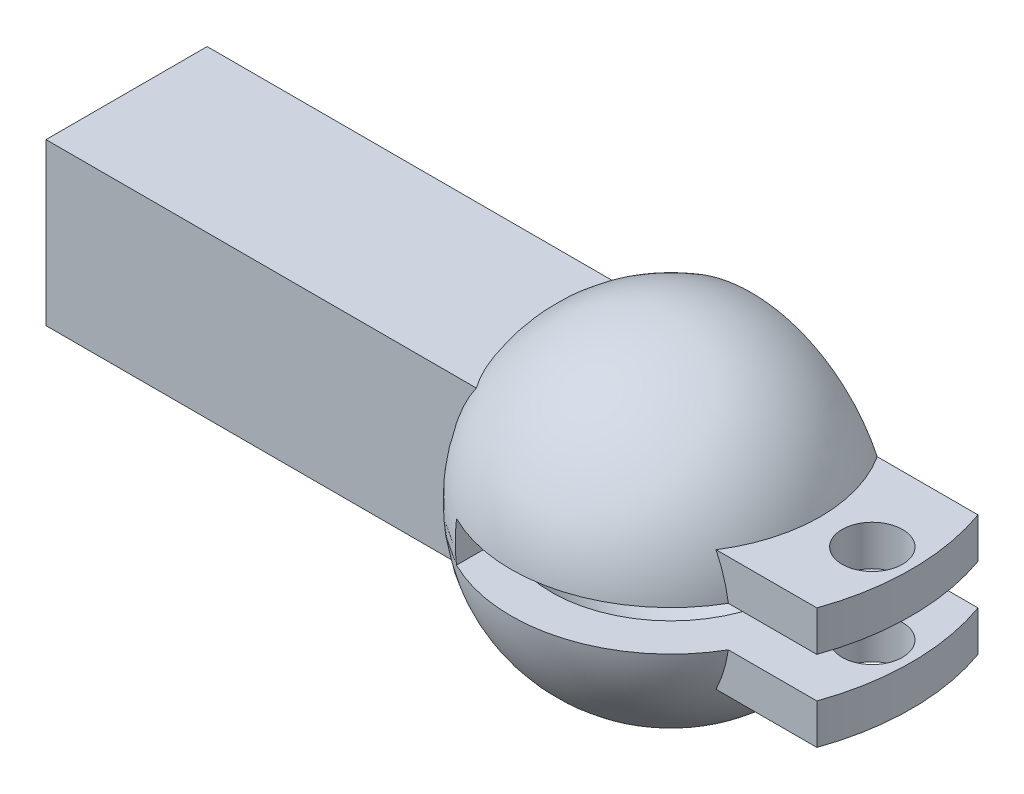
ISO-10303-21;
HEADER;
FILE_DESCRIPTION(('STEP AP214'),'2;1');
FILE_NAME('part.step','',(''),(''),'','','');
FILE_SCHEMA(('AUTOMOTIVE_DESIGN { 1 0 10303 214 1 1 1 1 }'));
ENDSEC;
DATA;
#1=APPLICATION_CONTEXT('core data for automotive mechanical design processes');
#2=APPLICATION_PROTOCOL_DEFINITION('international standard','automotive_design',2000,#1);
#3=PRODUCT_CONTEXT('',#1,'mechanical');
#4=PRODUCT('Part','Part','',(#3));
#5=PRODUCT_RELATED_PRODUCT_CATEGORY('part','',(#4));
#6=PRODUCT_DEFINITION_FORMATION('','',#4);
#7=PRODUCT_DEFINITION_CONTEXT('part definition',#1,'design');
#8=PRODUCT_DEFINITION('design','',#6,#7);
#9=PRODUCT_DEFINITION_SHAPE('','',#8);
#10=(LENGTH_UNIT() NAMED_UNIT(*) SI_UNIT(.MILLI.,.METRE.));
#11=(NAMED_UNIT(*) PLANE_ANGLE_UNIT() SI_UNIT($,.RADIAN.));
#12=(NAMED_UNIT(*) SI_UNIT($,.STERADIAN.) SOLID_ANGLE_UNIT());
#13=UNCERTAINTY_MEASURE_WITH_UNIT(LENGTH_MEASURE(1.E-05),#10,'distance_accuracy_value','');
#14=(GEOMETRIC_REPRESENTATION_CONTEXT(3) GLOBAL_UNCERTAINTY_ASSIGNED_CONTEXT((#13)) GLOBAL_UNIT_ASSIGNED_CONTEXT((#10,
#11,#12)) REPRESENTATION_CONTEXT('',''));
#15=CARTESIAN_POINT('',(0.,0.,0.));
#16=DIRECTION('',(0.,0.,1.));
#17=DIRECTION('',(1.,0.,0.));
#18=AXIS2_PLACEMENT_3D('',#15,#16,#17);
#19=CARTESIAN_POINT('',(27.0196854276496,4.,4.));
#20=DIRECTION('',(0.,-1.,0.));
#21=DIRECTION('',(-1.,0.,0.));
#22=AXIS2_PLACEMENT_3D('',#19,#20,#21);
#23=SPHERICAL_SURFACE('',#22,8.);
#24=CARTESIAN_POINT('',(27.0196854276496,4.,8.));
#25=DIRECTION('',(0.,0.,-1.));
#26=DIRECTION('',(-1.,0.,0.));
#27=AXIS2_PLACEMENT_3D('',#24,#25,#26);
#28=CIRCLE('',#27,6.92820323027551);
#29=CARTESIAN_POINT('',(33.8753400280507,3.,8.));
#30=VERTEX_POINT('',#29);
#31=CARTESIAN_POINT('',(33.264683426048,0.999999999999999,8.));
#32=VERTEX_POINT('',#31);
#33=EDGE_CURVE('E179',#30,#32,#28,.T.);
#34=ORIENTED_EDGE('',*,*,#33,.F.);
#35=CARTESIAN_POINT('',(27.0196854276496,3.,4.));
#36=DIRECTION('',(0.,-1.,0.));
#37=DIRECTION('',(0.,0.,-1.));
#38=AXIS2_PLACEMENT_3D('',#35,#36,#37);
#39=CIRCLE('',#38,7.93725393319377);
#40=CARTESIAN_POINT('',(23.4861986461041,3.,11.1073533164353));
#41=VERTEX_POINT('',#40);
#42=EDGE_CURVE('E239',#30,#41,#39,.T.);
#43=ORIENTED_EDGE('',*,*,#42,.T.);
#44=CARTESIAN_POINT('',(23.4861986461041,4.,4.));
#45=DIRECTION('',(-1.,0.,0.));
#46=DIRECTION('',(0.,0.,1.));
#47=AXIS2_PLACEMENT_3D('',#44,#45,#46);
#48=CIRCLE('',#47,7.17735823020165);
#49=CARTESIAN_POINT('',(23.4861986461041,5.,11.1073533164353));
#50=VERTEX_POINT('',#49);
#51=EDGE_CURVE('E241',#41,#50,#48,.T.);
#52=ORIENTED_EDGE('',*,*,#51,.T.);
#53=CARTESIAN_POINT('',(27.0196854276496,5.,4.));
#54=DIRECTION('',(0.,1.,0.));
#55=DIRECTION('',(0.,0.,1.));
#56=AXIS2_PLACEMENT_3D('',#53,#54,#55);
#57=CIRCLE('',#56,7.93725393319377);
#58=CARTESIAN_POINT('',(33.8753400280507,5.,8.));
#59=VERTEX_POINT('',#58);
#60=EDGE_CURVE('E246',#50,#59,#57,.T.);
#61=ORIENTED_EDGE('',*,*,#60,.T.);
#62=CARTESIAN_POINT('',(27.0196854276496,4.,8.));
#63=DIRECTION('',(0.,0.,1.));
#64=DIRECTION('',(1.,0.,0.));
#65=AXIS2_PLACEMENT_3D('',#62,#63,#64);
#66=CIRCLE('',#65,6.92820323027551);
#67=CARTESIAN_POINT('',(33.264683426048,7.,8.));
#68=VERTEX_POINT('',#67);
#69=EDGE_CURVE('E213',#59,#68,#66,.T.);
#70=ORIENTED_EDGE('',*,*,#69,.T.);
#71=CARTESIAN_POINT('',(27.0196854276496,7.,4.));
#72=DIRECTION('',(0.,1.,0.));
#73=DIRECTION('',(0.,0.,1.));
#74=AXIS2_PLACEMENT_3D('',#71,#72,#73);
#75=CIRCLE('',#74,7.41619848709566);
#76=CARTESIAN_POINT('',(33.264683426048,7.,0.));
#77=VERTEX_POINT('',#76);
#78=EDGE_CURVE('E218',#68,#77,#75,.T.);
#79=ORIENTED_EDGE('',*,*,#78,.T.);
#80=CARTESIAN_POINT('',(27.0196854276496,4.,0.));
#81=DIRECTION('',(0.,0.,-1.));
#82=DIRECTION('',(-1.,0.,0.));
#83=AXIS2_PLACEMENT_3D('',#80,#81,#82);
#84=CIRCLE('',#83,6.92820323027551);
#85=CARTESIAN_POINT('',(21.3628311781572,8.,0.));
#86=VERTEX_POINT('',#85);
#87=EDGE_CURVE('E260',#86,#77,#84,.T.);
#88=ORIENTED_EDGE('',*,*,#87,.F.);
#89=CARTESIAN_POINT('',(27.0196854276496,8.,4.));
#90=DIRECTION('',(0.,-1.,0.));
#91=DIRECTION('',(0.,0.,-1.));
#92=AXIS2_PLACEMENT_3D('',#89,#90,#91);
#93=CIRCLE('',#92,6.9282032302755);
#94=CARTESIAN_POINT('',(21.3628311781572,8.,8.));
#95=VERTEX_POINT('',#94);
#96=EDGE_CURVE('E278',#86,#95,#93,.F.);
#97=ORIENTED_EDGE('',*,*,#96,.T.);
#98=CARTESIAN_POINT('',(27.0196854276496,4.,8.));
#99=DIRECTION('',(0.,0.,1.));
#100=DIRECTION('',(1.,0.,0.));
#101=AXIS2_PLACEMENT_3D('',#98,#99,#100);
#102=CIRCLE('',#101,6.92820323027551);
#103=CARTESIAN_POINT('',(21.3628311781572,0.,8.));
#104=VERTEX_POINT('',#103);
#105=EDGE_CURVE('E289',#95,#104,#102,.T.);
#106=ORIENTED_EDGE('',*,*,#105,.T.);
#107=CARTESIAN_POINT('',(27.0196854276496,0.,4.));
#108=DIRECTION('',(0.,-1.,0.));
#109=DIRECTION('',(1.,0.,0.));
#110=AXIS2_PLACEMENT_3D('',#107,#108,#109);
#111=CIRCLE('',#110,6.92820323027551);
#112=CARTESIAN_POINT('',(21.3628311781572,0.,0.));
#113=VERTEX_POINT('',#112);
#114=EDGE_CURVE('E275',#113,#104,#111,.F.);
#115=ORIENTED_EDGE('',*,*,#114,.F.);
#116=CARTESIAN_POINT('',(33.264683426048,0.999999999999999,0.));
#117=VERTEX_POINT('',#116);
#118=EDGE_CURVE('E66',#117,#113,#84,.T.);
#119=ORIENTED_EDGE('',*,*,#118,.F.);
#120=CARTESIAN_POINT('',(27.0196854276496,0.999999999999999,4.));
#121=DIRECTION('',(0.,1.,0.));
#122=DIRECTION('',(0.,0.,-1.));
#123=AXIS2_PLACEMENT_3D('',#120,#121,#122);
#124=CIRCLE('',#123,7.41619848709566);
#125=EDGE_CURVE('E61',#32,#117,#124,.T.);
#126=ORIENTED_EDGE('',*,*,#125,.F.);
#127=EDGE_LOOP('',(#34,#43,#52,#61,#70,#79,#88,#97,#106,#115,#119,#126));
#128=FACE_BOUND('',#127,.T.);
#129=ADVANCED_FACE('F45',(#128),#23,.T.);
#130=CARTESIAN_POINT('',(0.,8.,4.));
#131=DIRECTION('',(0.,-1.,0.));
#132=DIRECTION('',(0.,0.,-1.));
#133=AXIS2_PLACEMENT_3D('',#130,#131,#132);
#134=PLANE('',#133);
#135=DIRECTION('',(-1.,0.,0.));
#136=VECTOR('',#135,1.);
#137=CARTESIAN_POINT('',(0.,8.,0.));
#138=LINE('',#137,#136);
#139=CARTESIAN_POINT('',(0.,8.,0.));
#140=VERTEX_POINT('',#139);
#141=EDGE_CURVE('E280',#86,#140,#138,.T.);
#142=ORIENTED_EDGE('',*,*,#141,.T.);
#143=DIRECTION('',(0.,0.,1.));
#144=VECTOR('',#143,1.);
#145=CARTESIAN_POINT('',(0.,8.,0.));
#146=LINE('',#145,#144);
#147=CARTESIAN_POINT('',(0.,8.,8.));
#148=VERTEX_POINT('',#147);
#149=EDGE_CURVE('E255',#140,#148,#146,.T.);
#150=ORIENTED_EDGE('',*,*,#149,.T.);
#151=DIRECTION('',(-1.,0.,0.));
#152=VECTOR('',#151,1.);
#153=CARTESIAN_POINT('',(0.,8.,8.));
#154=LINE('',#153,#152);
#155=EDGE_CURVE('E265',#95,#148,#154,.T.);
#156=ORIENTED_EDGE('',*,*,#155,.F.);
#157=ORIENTED_EDGE('',*,*,#96,.F.);
#158=EDGE_LOOP('',(#142,#150,#156,#157));
#159=FACE_BOUND('',#158,.T.);
#160=ADVANCED_FACE('F47',(#159),#134,.F.);
#161=CARTESIAN_POINT('',(0.,0.,4.));
#162=DIRECTION('',(0.,-1.,0.));
#163=DIRECTION('',(1.,0.,0.));
#164=AXIS2_PLACEMENT_3D('',#161,#162,#163);
#165=PLANE('',#164);
#166=DIRECTION('',(0.,0.,1.));
#167=VECTOR('',#166,1.);
#168=CARTESIAN_POINT('',(0.,0.,0.));
#169=LINE('',#168,#167);
#170=CARTESIAN_POINT('',(0.,0.,0.));
#171=VERTEX_POINT('',#170);
#172=CARTESIAN_POINT('',(0.,0.,8.));
#173=VERTEX_POINT('',#172);
#174=EDGE_CURVE('E253',#171,#173,#169,.T.);
#175=ORIENTED_EDGE('',*,*,#174,.F.);
#176=DIRECTION('',(-1.,0.,0.));
#177=VECTOR('',#176,1.);
#178=CARTESIAN_POINT('',(0.,0.,0.));
#179=LINE('',#178,#177);
#180=EDGE_CURVE('E283',#113,#171,#179,.T.);
#181=ORIENTED_EDGE('',*,*,#180,.F.);
#182=ORIENTED_EDGE('',*,*,#114,.T.);
#183=DIRECTION('',(1.,0.,0.));
#184=VECTOR('',#183,1.);
#185=CARTESIAN_POINT('',(0.,0.,8.));
#186=LINE('',#185,#184);
#187=EDGE_CURVE('E263',#173,#104,#186,.T.);
#188=ORIENTED_EDGE('',*,*,#187,.F.);
#189=EDGE_LOOP('',(#175,#181,#182,#188));
#190=FACE_BOUND('',#189,.T.);
#191=ADVANCED_FACE('F340',(#190),#165,.T.);
#192=CARTESIAN_POINT('',(0.,0.,0.));
#193=DIRECTION('',(0.,0.,1.));
#194=DIRECTION('',(1.,0.,0.));
#195=AXIS2_PLACEMENT_3D('',#192,#193,#194);
#196=PLANE('',#195);
#197=DIRECTION('',(1.,0.,0.));
#198=VECTOR('',#197,1.);
#199=CARTESIAN_POINT('',(0.,3.,0.));
#200=LINE('',#199,#198);
#201=CARTESIAN_POINT('',(31.3785843711903,3.,0.));
#202=VERTEX_POINT('',#201);
#203=CARTESIAN_POINT('',(38.2668197944806,3.,0.));
#204=VERTEX_POINT('',#203);
#205=EDGE_CURVE('E176',#202,#204,#200,.T.);
#206=ORIENTED_EDGE('',*,*,#205,.T.);
#207=DIRECTION('',(0.,1.,0.));
#208=VECTOR('',#207,1.);
#209=CARTESIAN_POINT('',(38.2668197944806,0.999999999999999,0.));
#210=LINE('',#209,#208);
#211=CARTESIAN_POINT('',(38.2668197944806,0.999999999999999,0.));
#212=VERTEX_POINT('',#211);
#213=EDGE_CURVE('E173',#212,#204,#210,.T.);
#214=ORIENTED_EDGE('',*,*,#213,.F.);
#215=DIRECTION('',(1.,0.,0.));
#216=VECTOR('',#215,1.);
#217=CARTESIAN_POINT('',(33.264683426048,0.999999999999999,0.));
#218=LINE('',#217,#216);
#219=EDGE_CURVE('E163',#117,#212,#218,.T.);
#220=ORIENTED_EDGE('',*,*,#219,.F.);
#221=ORIENTED_EDGE('',*,*,#118,.T.);
#222=ORIENTED_EDGE('',*,*,#180,.T.);
#223=DIRECTION('',(0.,1.,0.));
#224=VECTOR('',#223,1.);
#225=CARTESIAN_POINT('',(0.,0.,0.));
#226=LINE('',#225,#224);
#227=EDGE_CURVE('E250',#171,#140,#226,.T.);
#228=ORIENTED_EDGE('',*,*,#227,.T.);
#229=ORIENTED_EDGE('',*,*,#141,.F.);
#230=ORIENTED_EDGE('',*,*,#87,.T.);
#231=DIRECTION('',(-1.,0.,0.));
#232=VECTOR('',#231,1.);
#233=CARTESIAN_POINT('',(32.5977813035285,7.,0.));
#234=LINE('',#233,#232);
#235=CARTESIAN_POINT('',(38.2668197944806,7.,0.));
#236=VERTEX_POINT('',#235);
#237=EDGE_CURVE('E202',#236,#77,#234,.T.);
#238=ORIENTED_EDGE('',*,*,#237,.F.);
#239=DIRECTION('',(0.,1.,0.));
#240=VECTOR('',#239,1.);
#241=CARTESIAN_POINT('',(38.2668197944806,5.,0.));
#242=LINE('',#241,#240);
#243=CARTESIAN_POINT('',(38.2668197944806,5.,0.));
#244=VERTEX_POINT('',#243);
#245=EDGE_CURVE('E211',#244,#236,#242,.T.);
#246=ORIENTED_EDGE('',*,*,#245,.F.);
#247=DIRECTION('',(-1.,0.,0.));
#248=VECTOR('',#247,1.);
#249=CARTESIAN_POINT('',(0.,5.,0.));
#250=LINE('',#249,#248);
#251=CARTESIAN_POINT('',(31.3785843711903,5.,0.));
#252=VERTEX_POINT('',#251);
#253=EDGE_CURVE('E244',#244,#252,#250,.T.);
#254=ORIENTED_EDGE('',*,*,#253,.T.);
#255=CARTESIAN_POINT('',(27.0196854276496,4.,0.));
#256=DIRECTION('',(0.,0.,-1.));
#257=DIRECTION('',(-1.,0.,0.));
#258=AXIS2_PLACEMENT_3D('',#255,#256,#257);
#259=CIRCLE('',#258,4.47213595499958);
#260=EDGE_CURVE('E258',#202,#252,#259,.T.);
#261=ORIENTED_EDGE('',*,*,#260,.F.);
#262=EDGE_LOOP('',(#206,#214,#220,#221,#222,#228,#229,#230,#238,#246,#254,#261));
#263=FACE_BOUND('',#262,.T.);
#264=ADVANCED_FACE('F174',(#263),#196,.F.);
#265=CARTESIAN_POINT('',(0.,0.,8.));
#266=DIRECTION('',(0.,0.,1.));
#267=DIRECTION('',(1.,0.,0.));
#268=AXIS2_PLACEMENT_3D('',#265,#266,#267);
#269=PLANE('',#268);
#270=DIRECTION('',(0.,1.,0.));
#271=VECTOR('',#270,1.);
#272=CARTESIAN_POINT('',(0.,0.,8.));
#273=LINE('',#272,#271);
#274=EDGE_CURVE('E249',#173,#148,#273,.T.);
#275=ORIENTED_EDGE('',*,*,#274,.F.);
#276=ORIENTED_EDGE('',*,*,#187,.T.);
#277=ORIENTED_EDGE('',*,*,#105,.F.);
#278=ORIENTED_EDGE('',*,*,#155,.T.);
#279=EDGE_LOOP('',(#275,#276,#277,#278));
#280=FACE_BOUND('',#279,.T.);
#281=ADVANCED_FACE('F345',(#280),#269,.T.);
#282=CARTESIAN_POINT('',(27.0196854276496,4.,4.));
#283=DIRECTION('',(0.,-1.,0.));
#284=DIRECTION('',(-1.,0.,0.));
#285=AXIS2_PLACEMENT_3D('',#282,#283,#284);
#286=SPHERICAL_SURFACE('',#285,6.);
#287=CARTESIAN_POINT('',(27.0196854276496,5.,4.));
#288=DIRECTION('',(0.,1.,0.));
#289=DIRECTION('',(0.,0.,1.));
#290=AXIS2_PLACEMENT_3D('',#287,#288,#289);
#291=CIRCLE('',#290,5.91607978309962);
#292=CARTESIAN_POINT('',(23.4861986461041,5.,8.74494163975105));
#293=VERTEX_POINT('',#292);
#294=EDGE_CURVE('E11',#293,#252,#291,.T.);
#295=ORIENTED_EDGE('',*,*,#294,.F.);
#296=CARTESIAN_POINT('',(23.4861986461041,4.,4.));
#297=DIRECTION('',(-1.,0.,0.));
#298=DIRECTION('',(0.,0.,1.));
#299=AXIS2_PLACEMENT_3D('',#296,#297,#298);
#300=CIRCLE('',#299,4.84917221437261);
#301=CARTESIAN_POINT('',(23.4861986461041,3.,8.74494163975105));
#302=VERTEX_POINT('',#301);
#303=EDGE_CURVE('E54',#302,#293,#300,.T.);
#304=ORIENTED_EDGE('',*,*,#303,.F.);
#305=CARTESIAN_POINT('',(27.0196854276496,3.,4.));
#306=DIRECTION('',(0.,-1.,0.));
#307=DIRECTION('',(0.,0.,-1.));
#308=AXIS2_PLACEMENT_3D('',#305,#306,#307);
#309=CIRCLE('',#308,5.91607978309962);
#310=EDGE_CURVE('E292',#202,#302,#309,.T.);
#311=ORIENTED_EDGE('',*,*,#310,.F.);
#312=ORIENTED_EDGE('',*,*,#260,.T.);
#313=EDGE_LOOP('',(#295,#304,#311,#312));
#314=FACE_BOUND('',#313,.T.);
#315=CARTESIAN_POINT('',(27.0196854276496,4.,4.));
#316=DIRECTION('',(0.,0.,1.));
#317=DIRECTION('',(1.,0.,0.));
#318=AXIS2_PLACEMENT_3D('',#315,#316,#317);
#319=CIRCLE('',#318,6.);
#320=CARTESIAN_POINT('',(21.5196854276496,1.60208423834363,4.));
#321=VERTEX_POINT('',#320);
#322=CARTESIAN_POINT('',(21.3628311781572,1.99999999999998,4.));
#323=VERTEX_POINT('',#322);
#324=EDGE_CURVE('E272',#321,#323,#319,.F.);
#325=ORIENTED_EDGE('',*,*,#324,.T.);
#326=CARTESIAN_POINT('',(21.3628311781572,4.,4.));
#327=DIRECTION('',(-1.,0.,0.));
#328=DIRECTION('',(0.,0.,1.));
#329=AXIS2_PLACEMENT_3D('',#326,#327,#328);
#330=CIRCLE('',#329,2.00000000000002);
#331=CARTESIAN_POINT('',(21.3628311781572,6.00000000000002,4.));
#332=VERTEX_POINT('',#331);
#333=EDGE_CURVE('E268',#323,#332,#330,.T.);
#334=ORIENTED_EDGE('',*,*,#333,.T.);
#335=CARTESIAN_POINT('',(21.5196854276496,6.39791576165636,4.));
#336=VERTEX_POINT('',#335);
#337=EDGE_CURVE('E271',#332,#336,#319,.F.);
#338=ORIENTED_EDGE('',*,*,#337,.T.);
#339=CARTESIAN_POINT('',(21.5196854276496,4.,4.));
#340=DIRECTION('',(-1.,0.,0.));
#341=DIRECTION('',(0.,0.,1.));
#342=AXIS2_PLACEMENT_3D('',#339,#340,#341);
#343=CIRCLE('',#342,2.39791576165636);
#344=EDGE_CURVE('E286',#321,#336,#343,.F.);
#345=ORIENTED_EDGE('',*,*,#344,.F.);
#346=EDGE_LOOP('',(#325,#334,#338,#345));
#347=FACE_BOUND('',#346,.T.);
#348=ADVANCED_FACE('F308',(#314,#347),#286,.F.);
#349=CARTESIAN_POINT('',(21.3628311781572,0.,8.));
#350=DIRECTION('',(-1.,0.,0.));
#351=DIRECTION('',(0.,0.,1.));
#352=AXIS2_PLACEMENT_3D('',#349,#350,#351);
#353=PLANE('',#352);
#354=ORIENTED_EDGE('',*,*,#333,.F.);
#355=DIRECTION('',(0.,-1.,0.));
#356=VECTOR('',#355,1.);
#357=CARTESIAN_POINT('',(21.3628311781572,6.39791576165636,4.));
#358=LINE('',#357,#356);
#359=CARTESIAN_POINT('',(21.3628311781572,1.60208423834363,4.));
#360=VERTEX_POINT('',#359);
#361=EDGE_CURVE('E221',#323,#360,#358,.T.);
#362=ORIENTED_EDGE('',*,*,#361,.T.);
#363=CARTESIAN_POINT('',(21.3628311781572,4.,4.));
#364=DIRECTION('',(-1.,0.,0.));
#365=DIRECTION('',(0.,0.,1.));
#366=AXIS2_PLACEMENT_3D('',#363,#364,#365);
#367=CIRCLE('',#366,2.39791576165636);
#368=CARTESIAN_POINT('',(21.3628311781572,6.39791576165636,4.));
#369=VERTEX_POINT('',#368);
#370=EDGE_CURVE('E225',#360,#369,#367,.F.);
#371=ORIENTED_EDGE('',*,*,#370,.T.);
#372=EDGE_CURVE('E222',#369,#332,#358,.T.);
#373=ORIENTED_EDGE('',*,*,#372,.T.);
#374=EDGE_LOOP('',(#354,#362,#371,#373));
#375=FACE_BOUND('',#374,.T.);
#376=ADVANCED_FACE('F363',(#375),#353,.F.);
#377=CARTESIAN_POINT('',(0.,0.,0.));
#378=DIRECTION('',(1.,0.,0.));
#379=DIRECTION('',(0.,0.,-1.));
#380=AXIS2_PLACEMENT_3D('',#377,#378,#379);
#381=PLANE('',#380);
#382=ORIENTED_EDGE('',*,*,#274,.T.);
#383=ORIENTED_EDGE('',*,*,#149,.F.);
#384=ORIENTED_EDGE('',*,*,#227,.F.);
#385=ORIENTED_EDGE('',*,*,#174,.T.);
#386=EDGE_LOOP('',(#382,#383,#384,#385));
#387=FACE_BOUND('',#386,.T.);
#388=ADVANCED_FACE('F361',(#387),#381,.F.);
#389=CARTESIAN_POINT('',(23.4861986461041,5.,12.));
#390=DIRECTION('',(0.,1.,0.));
#391=DIRECTION('',(0.,0.,1.));
#392=AXIS2_PLACEMENT_3D('',#389,#390,#391);
#393=PLANE('',#392);
#394=CARTESIAN_POINT('',(37.0196854276496,5.,4.));
#395=DIRECTION('',(0.,1.,0.));
#396=DIRECTION('',(0.,0.,1.));
#397=AXIS2_PLACEMENT_3D('',#394,#395,#396);
#398=CIRCLE('',#397,1.5);
#399=CARTESIAN_POINT('',(37.0196854276496,5.,5.5));
#400=VERTEX_POINT('',#399);
#401=EDGE_CURVE('E193',#400,#400,#398,.T.);
#402=ORIENTED_EDGE('',*,*,#401,.T.);
#403=EDGE_LOOP('',(#402));
#404=FACE_BOUND('',#403,.T.);
#405=ORIENTED_EDGE('',*,*,#294,.T.);
#406=ORIENTED_EDGE('',*,*,#253,.F.);
#407=CARTESIAN_POINT('',(27.0196854276496,5.,4.));
#408=DIRECTION('',(0.,1.,0.));
#409=DIRECTION('',(0.,0.,1.));
#410=AXIS2_PLACEMENT_3D('',#407,#408,#409);
#411=CIRCLE('',#410,11.9372539331938);
#412=CARTESIAN_POINT('',(38.2668197944806,5.,8.));
#413=VERTEX_POINT('',#412);
#414=EDGE_CURVE('E201',#413,#244,#411,.T.);
#415=ORIENTED_EDGE('',*,*,#414,.F.);
#416=DIRECTION('',(1.,0.,0.));
#417=VECTOR('',#416,1.);
#418=CARTESIAN_POINT('',(32.5977813035285,5.,8.));
#419=LINE('',#418,#417);
#420=EDGE_CURVE('E199',#59,#413,#419,.T.);
#421=ORIENTED_EDGE('',*,*,#420,.F.);
#422=ORIENTED_EDGE('',*,*,#60,.F.);
#423=DIRECTION('',(0.,0.,-1.));
#424=VECTOR('',#423,1.);
#425=CARTESIAN_POINT('',(23.4861986461041,5.,12.));
#426=LINE('',#425,#424);
#427=EDGE_CURVE('E233',#50,#293,#426,.T.);
#428=ORIENTED_EDGE('',*,*,#427,.T.);
#429=EDGE_LOOP('',(#405,#406,#415,#421,#422,#428));
#430=FACE_BOUND('',#429,.T.);
#431=ADVANCED_FACE('F306',(#404,#430),#393,.F.);
#432=CARTESIAN_POINT('',(23.4861986461041,5.,12.));
#433=DIRECTION('',(-1.,0.,0.));
#434=DIRECTION('',(0.,0.,1.));
#435=AXIS2_PLACEMENT_3D('',#432,#433,#434);
#436=PLANE('',#435);
#437=DIRECTION('',(0.,0.,-1.));
#438=VECTOR('',#437,1.);
#439=CARTESIAN_POINT('',(23.4861986461041,3.,12.));
#440=LINE('',#439,#438);
#441=EDGE_CURVE('E232',#41,#302,#440,.T.);
#442=ORIENTED_EDGE('',*,*,#441,.T.);
#443=ORIENTED_EDGE('',*,*,#303,.T.);
#444=ORIENTED_EDGE('',*,*,#427,.F.);
#445=ORIENTED_EDGE('',*,*,#51,.F.);
#446=EDGE_LOOP('',(#442,#443,#444,#445));
#447=FACE_BOUND('',#446,.T.);
#448=ADVANCED_FACE('F299',(#447),#436,.F.);
#449=CARTESIAN_POINT('',(23.4861986461041,3.,12.));
#450=DIRECTION('',(0.,-1.,0.));
#451=DIRECTION('',(0.,0.,-1.));
#452=AXIS2_PLACEMENT_3D('',#449,#450,#451);
#453=PLANE('',#452);
#454=CARTESIAN_POINT('',(37.0196854276496,3.,4.));
#455=DIRECTION('',(0.,-1.,0.));
#456=DIRECTION('',(0.,0.,-1.));
#457=AXIS2_PLACEMENT_3D('',#454,#455,#456);
#458=CIRCLE('',#457,1.5);
#459=CARTESIAN_POINT('',(37.0196854276496,3.,2.5));
#460=VERTEX_POINT('',#459);
#461=EDGE_CURVE('E499',#460,#460,#458,.T.);
#462=ORIENTED_EDGE('',*,*,#461,.T.);
#463=EDGE_LOOP('',(#462));
#464=FACE_BOUND('',#463,.T.);
#465=CARTESIAN_POINT('',(27.0196854276496,3.,4.));
#466=DIRECTION('',(0.,-1.,0.));
#467=DIRECTION('',(0.,0.,-1.));
#468=AXIS2_PLACEMENT_3D('',#465,#466,#467);
#469=CIRCLE('',#468,11.9372539331938);
#470=CARTESIAN_POINT('',(38.2668197944806,3.,8.));
#471=VERTEX_POINT('',#470);
#472=EDGE_CURVE('E190',#204,#471,#469,.T.);
#473=ORIENTED_EDGE('',*,*,#472,.F.);
#474=ORIENTED_EDGE('',*,*,#205,.F.);
#475=ORIENTED_EDGE('',*,*,#310,.T.);
#476=ORIENTED_EDGE('',*,*,#441,.F.);
#477=ORIENTED_EDGE('',*,*,#42,.F.);
#478=DIRECTION('',(-1.,0.,0.));
#479=VECTOR('',#478,1.);
#480=CARTESIAN_POINT('',(38.2668197944806,3.,8.));
#481=LINE('',#480,#479);
#482=EDGE_CURVE('E192',#471,#30,#481,.T.);
#483=ORIENTED_EDGE('',*,*,#482,.F.);
#484=EDGE_LOOP('',(#473,#474,#475,#476,#477,#483));
#485=FACE_BOUND('',#484,.T.);
#486=ADVANCED_FACE('F321',(#464,#485),#453,.F.);
#487=CARTESIAN_POINT('',(16.0009285307754,6.39791576165636,4.));
#488=DIRECTION('',(0.,0.,1.));
#489=DIRECTION('',(1.,0.,0.));
#490=AXIS2_PLACEMENT_3D('',#487,#488,#489);
#491=PLANE('',#490);
#492=ORIENTED_EDGE('',*,*,#337,.F.);
#493=ORIENTED_EDGE('',*,*,#372,.F.);
#494=DIRECTION('',(1.,0.,0.));
#495=VECTOR('',#494,1.);
#496=CARTESIAN_POINT('',(16.0009285307754,6.39791576165636,4.));
#497=LINE('',#496,#495);
#498=EDGE_CURVE('E228',#369,#336,#497,.T.);
#499=ORIENTED_EDGE('',*,*,#498,.T.);
#500=EDGE_LOOP('',(#492,#493,#499));
#501=FACE_BOUND('',#500,.T.);
#502=ADVANCED_FACE('F395',(#501),#491,.F.);
#503=ORIENTED_EDGE('',*,*,#324,.F.);
#504=DIRECTION('',(1.,0.,0.));
#505=VECTOR('',#504,1.);
#506=CARTESIAN_POINT('',(16.0009285307754,1.60208423834363,4.));
#507=LINE('',#506,#505);
#508=EDGE_CURVE('E224',#360,#321,#507,.T.);
#509=ORIENTED_EDGE('',*,*,#508,.F.);
#510=ORIENTED_EDGE('',*,*,#361,.F.);
#511=EDGE_LOOP('',(#503,#509,#510));
#512=FACE_BOUND('',#511,.T.);
#513=ADVANCED_FACE('F398',(#512),#491,.F.);
#514=CARTESIAN_POINT('',(16.0009285307754,4.,4.));
#515=DIRECTION('',(1.,0.,0.));
#516=DIRECTION('',(0.,0.,-1.));
#517=AXIS2_PLACEMENT_3D('',#514,#515,#516);
#518=CYLINDRICAL_SURFACE('',#517,2.39791576165636);
#519=ORIENTED_EDGE('',*,*,#508,.T.);
#520=ORIENTED_EDGE('',*,*,#344,.T.);
#521=ORIENTED_EDGE('',*,*,#498,.F.);
#522=ORIENTED_EDGE('',*,*,#370,.F.);
#523=EDGE_LOOP('',(#519,#520,#521,#522));
#524=FACE_BOUND('',#523,.T.);
#525=ADVANCED_FACE('F407',(#524),#518,.F.);
#526=CARTESIAN_POINT('',(27.0196854276496,7.,4.));
#527=DIRECTION('',(0.,1.,0.));
#528=DIRECTION('',(0.,0.,1.));
#529=AXIS2_PLACEMENT_3D('',#526,#527,#528);
#530=PLANE('',#529);
#531=CARTESIAN_POINT('',(37.0196854276496,7.,4.));
#532=DIRECTION('',(0.,1.,0.));
#533=DIRECTION('',(0.,0.,1.));
#534=AXIS2_PLACEMENT_3D('',#531,#532,#533);
#535=CIRCLE('',#534,1.5);
#536=CARTESIAN_POINT('',(37.0196854276496,7.,5.5));
#537=VERTEX_POINT('',#536);
#538=EDGE_CURVE('E496',#537,#537,#535,.T.);
#539=ORIENTED_EDGE('',*,*,#538,.F.);
#540=EDGE_LOOP('',(#539));
#541=FACE_BOUND('',#540,.T.);
#542=ORIENTED_EDGE('',*,*,#78,.F.);
#543=DIRECTION('',(1.,0.,0.));
#544=VECTOR('',#543,1.);
#545=CARTESIAN_POINT('',(32.5977813035285,7.,8.));
#546=LINE('',#545,#544);
#547=CARTESIAN_POINT('',(38.2668197944806,7.,8.));
#548=VERTEX_POINT('',#547);
#549=EDGE_CURVE('E198',#68,#548,#546,.T.);
#550=ORIENTED_EDGE('',*,*,#549,.T.);
#551=CARTESIAN_POINT('',(27.0196854276496,7.,4.));
#552=DIRECTION('',(0.,1.,0.));
#553=DIRECTION('',(0.,0.,1.));
#554=AXIS2_PLACEMENT_3D('',#551,#552,#553);
#555=CIRCLE('',#554,11.9372539331938);
#556=EDGE_CURVE('E207',#548,#236,#555,.T.);
#557=ORIENTED_EDGE('',*,*,#556,.T.);
#558=ORIENTED_EDGE('',*,*,#237,.T.);
#559=EDGE_LOOP('',(#542,#550,#557,#558));
#560=FACE_BOUND('',#559,.T.);
#561=ADVANCED_FACE('F415',(#541,#560),#530,.T.);
#562=CARTESIAN_POINT('',(32.5977813035285,5.,8.));
#563=DIRECTION('',(0.,0.,1.));
#564=DIRECTION('',(1.,0.,0.));
#565=AXIS2_PLACEMENT_3D('',#562,#563,#564);
#566=PLANE('',#565);
#567=ORIENTED_EDGE('',*,*,#69,.F.);
#568=ORIENTED_EDGE('',*,*,#420,.T.);
#569=DIRECTION('',(0.,1.,0.));
#570=VECTOR('',#569,1.);
#571=CARTESIAN_POINT('',(38.2668197944806,5.,8.));
#572=LINE('',#571,#570);
#573=EDGE_CURVE('E205',#413,#548,#572,.T.);
#574=ORIENTED_EDGE('',*,*,#573,.T.);
#575=ORIENTED_EDGE('',*,*,#549,.F.);
#576=EDGE_LOOP('',(#567,#568,#574,#575));
#577=FACE_BOUND('',#576,.T.);
#578=ADVANCED_FACE('F319',(#577),#566,.T.);
#579=CARTESIAN_POINT('',(27.0196854276496,5.,4.));
#580=DIRECTION('',(0.,1.,0.));
#581=DIRECTION('',(0.,0.,1.));
#582=AXIS2_PLACEMENT_3D('',#579,#580,#581);
#583=CYLINDRICAL_SURFACE('',#582,11.9372539331938);
#584=ORIENTED_EDGE('',*,*,#556,.F.);
#585=ORIENTED_EDGE('',*,*,#573,.F.);
#586=ORIENTED_EDGE('',*,*,#414,.T.);
#587=ORIENTED_EDGE('',*,*,#245,.T.);
#588=EDGE_LOOP('',(#584,#585,#586,#587));
#589=FACE_BOUND('',#588,.T.);
#590=ADVANCED_FACE('F316',(#589),#583,.T.);
#591=CARTESIAN_POINT('',(38.2668197944806,0.999999999999999,8.));
#592=DIRECTION('',(0.,0.,-1.));
#593=DIRECTION('',(-1.,0.,0.));
#594=AXIS2_PLACEMENT_3D('',#591,#592,#593);
#595=PLANE('',#594);
#596=ORIENTED_EDGE('',*,*,#482,.T.);
#597=ORIENTED_EDGE('',*,*,#33,.T.);
#598=DIRECTION('',(-1.,0.,0.));
#599=VECTOR('',#598,1.);
#600=CARTESIAN_POINT('',(38.2668197944806,0.999999999999999,8.));
#601=LINE('',#600,#599);
#602=CARTESIAN_POINT('',(38.2668197944806,0.999999999999999,8.));
#603=VERTEX_POINT('',#602);
#604=EDGE_CURVE('E185',#603,#32,#601,.T.);
#605=ORIENTED_EDGE('',*,*,#604,.F.);
#606=DIRECTION('',(0.,1.,0.));
#607=VECTOR('',#606,1.);
#608=CARTESIAN_POINT('',(38.2668197944806,0.999999999999999,8.));
#609=LINE('',#608,#607);
#610=EDGE_CURVE('E180',#603,#471,#609,.T.);
#611=ORIENTED_EDGE('',*,*,#610,.T.);
#612=EDGE_LOOP('',(#596,#597,#605,#611));
#613=FACE_BOUND('',#612,.T.);
#614=ADVANCED_FACE('F324',(#613),#595,.F.);
#615=CARTESIAN_POINT('',(27.0196854276496,0.999999999999999,4.));
#616=DIRECTION('',(0.,1.,0.));
#617=DIRECTION('',(0.,0.,1.));
#618=AXIS2_PLACEMENT_3D('',#615,#616,#617);
#619=CYLINDRICAL_SURFACE('',#618,11.9372539331938);
#620=ORIENTED_EDGE('',*,*,#472,.T.);
#621=ORIENTED_EDGE('',*,*,#610,.F.);
#622=CARTESIAN_POINT('',(27.0196854276496,0.999999999999999,4.));
#623=DIRECTION('',(0.,-1.,0.));
#624=DIRECTION('',(0.,0.,-1.));
#625=AXIS2_PLACEMENT_3D('',#622,#623,#624);
#626=CIRCLE('',#625,11.9372539331938);
#627=EDGE_CURVE('E168',#212,#603,#626,.T.);
#628=ORIENTED_EDGE('',*,*,#627,.F.);
#629=ORIENTED_EDGE('',*,*,#213,.T.);
#630=EDGE_LOOP('',(#620,#621,#628,#629));
#631=FACE_BOUND('',#630,.T.);
#632=ADVANCED_FACE('F182',(#631),#619,.T.);
#633=CARTESIAN_POINT('',(27.0196854276496,0.999999999999999,4.));
#634=DIRECTION('',(0.,-1.,0.));
#635=DIRECTION('',(0.,0.,-1.));
#636=AXIS2_PLACEMENT_3D('',#633,#634,#635);
#637=PLANE('',#636);
#638=CARTESIAN_POINT('',(37.0196854276496,0.999999999999999,4.));
#639=DIRECTION('',(0.,-1.,0.));
#640=DIRECTION('',(0.,0.,-1.));
#641=AXIS2_PLACEMENT_3D('',#638,#639,#640);
#642=CIRCLE('',#641,1.5);
#643=CARTESIAN_POINT('',(37.0196854276496,0.999999999999999,2.5));
#644=VERTEX_POINT('',#643);
#645=EDGE_CURVE('E49',#644,#644,#642,.T.);
#646=ORIENTED_EDGE('',*,*,#645,.F.);
#647=EDGE_LOOP('',(#646));
#648=FACE_BOUND('',#647,.T.);
#649=ORIENTED_EDGE('',*,*,#125,.T.);
#650=ORIENTED_EDGE('',*,*,#219,.T.);
#651=ORIENTED_EDGE('',*,*,#627,.T.);
#652=ORIENTED_EDGE('',*,*,#604,.T.);
#653=EDGE_LOOP('',(#649,#650,#651,#652));
#654=FACE_BOUND('',#653,.T.);
#655=ADVANCED_FACE('F165',(#648,#654),#637,.T.);
#656=CARTESIAN_POINT('',(37.0196854276496,-4.,4.));
#657=DIRECTION('',(0.,1.,0.));
#658=DIRECTION('',(0.,0.,1.));
#659=AXIS2_PLACEMENT_3D('',#656,#657,#658);
#660=CYLINDRICAL_SURFACE('',#659,1.5);
#661=ORIENTED_EDGE('',*,*,#645,.T.);
#662=EDGE_LOOP('',(#661));
#663=FACE_BOUND('',#662,.T.);
#664=ORIENTED_EDGE('',*,*,#461,.F.);
#665=EDGE_LOOP('',(#664));
#666=FACE_BOUND('',#665,.T.);
#667=ADVANCED_FACE('F472',(#663,#666),#660,.F.);
#668=ORIENTED_EDGE('',*,*,#538,.T.);
#669=EDGE_LOOP('',(#668));
#670=FACE_BOUND('',#669,.T.);
#671=ORIENTED_EDGE('',*,*,#401,.F.);
#672=EDGE_LOOP('',(#671));
#673=FACE_BOUND('',#672,.T.);
#674=ADVANCED_FACE('F481',(#670,#673),#660,.F.);
#675=CLOSED_SHELL('',(#129,#160,#191,#264,#281,#348,#376,#388,#431,#448,#486,#502,#513,#525,
#561,#578,#590,#614,#632,#655,#667,#674));
#676=MANIFOLD_SOLID_BREP('B2',#675);
#677=ADVANCED_BREP_SHAPE_REPRESENTATION('',(#18,#676),#14);
#678=SHAPE_DEFINITION_REPRESENTATION(#9,#677);
ENDSEC;
END-ISO-10303-21;
